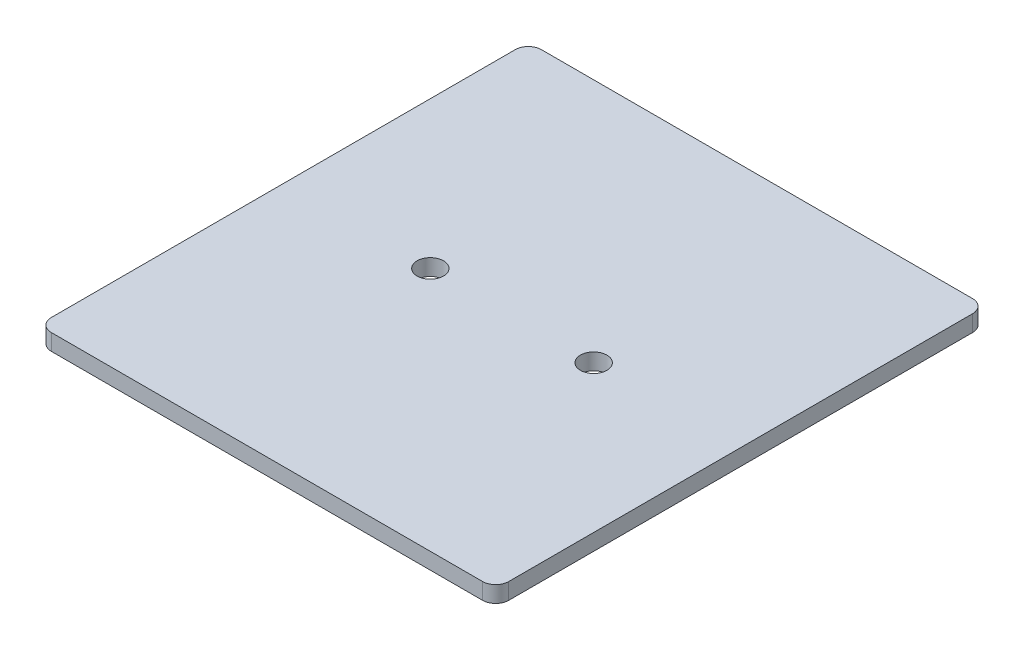
ISO-10303-21;
HEADER;
FILE_DESCRIPTION(('STEP AP214'),'2;1');
FILE_NAME('part.step','',(''),(''),'','','');
FILE_SCHEMA(('AUTOMOTIVE_DESIGN { 1 0 10303 214 1 1 1 1 }'));
ENDSEC;
DATA;
#1=APPLICATION_CONTEXT('core data for automotive mechanical design processes');
#2=APPLICATION_PROTOCOL_DEFINITION('international standard','automotive_design',2000,#1);
#3=PRODUCT_CONTEXT('',#1,'mechanical');
#4=PRODUCT('Part','Part','',(#3));
#5=PRODUCT_RELATED_PRODUCT_CATEGORY('part','',(#4));
#6=PRODUCT_DEFINITION_FORMATION('','',#4);
#7=PRODUCT_DEFINITION_CONTEXT('part definition',#1,'design');
#8=PRODUCT_DEFINITION('design','',#6,#7);
#9=PRODUCT_DEFINITION_SHAPE('','',#8);
#10=(LENGTH_UNIT() NAMED_UNIT(*) SI_UNIT(.MILLI.,.METRE.));
#11=(NAMED_UNIT(*) PLANE_ANGLE_UNIT() SI_UNIT($,.RADIAN.));
#12=(NAMED_UNIT(*) SI_UNIT($,.STERADIAN.) SOLID_ANGLE_UNIT());
#13=UNCERTAINTY_MEASURE_WITH_UNIT(LENGTH_MEASURE(1.E-05),#10,'distance_accuracy_value','');
#14=(GEOMETRIC_REPRESENTATION_CONTEXT(3) GLOBAL_UNCERTAINTY_ASSIGNED_CONTEXT((#13)) GLOBAL_UNIT_ASSIGNED_CONTEXT((#10,
#11,#12)) REPRESENTATION_CONTEXT('',''));
#15=CARTESIAN_POINT('',(0.,0.,0.));
#16=DIRECTION('',(0.,0.,1.));
#17=DIRECTION('',(1.,0.,0.));
#18=AXIS2_PLACEMENT_3D('',#15,#16,#17);
#19=CARTESIAN_POINT('',(70.,5.,-75.));
#20=DIRECTION('',(-1.,0.,0.));
#21=DIRECTION('',(0.,0.,1.));
#22=AXIS2_PLACEMENT_3D('',#19,#20,#21);
#23=PLANE('',#22);
#24=DIRECTION('',(0.,0.,-1.));
#25=VECTOR('',#24,1.);
#26=CARTESIAN_POINT('',(70.,0.,-75.));
#27=LINE('',#26,#25);
#28=CARTESIAN_POINT('',(70.,0.,71.));
#29=VERTEX_POINT('',#28);
#30=CARTESIAN_POINT('',(70.,0.,-71.));
#31=VERTEX_POINT('',#30);
#32=EDGE_CURVE('E138',#29,#31,#27,.T.);
#33=ORIENTED_EDGE('',*,*,#32,.T.);
#34=DIRECTION('',(0.,-1.,0.));
#35=VECTOR('',#34,1.);
#36=CARTESIAN_POINT('',(70.,5.,-71.));
#37=LINE('',#36,#35);
#38=CARTESIAN_POINT('',(70.,5.,-71.));
#39=VERTEX_POINT('',#38);
#40=EDGE_CURVE('E112',#31,#39,#37,.F.);
#41=ORIENTED_EDGE('',*,*,#40,.T.);
#42=DIRECTION('',(0.,0.,-1.));
#43=VECTOR('',#42,1.);
#44=CARTESIAN_POINT('',(70.,5.,-75.));
#45=LINE('',#44,#43);
#46=CARTESIAN_POINT('',(70.,5.,71.));
#47=VERTEX_POINT('',#46);
#48=EDGE_CURVE('E151',#47,#39,#45,.T.);
#49=ORIENTED_EDGE('',*,*,#48,.F.);
#50=DIRECTION('',(0.,-1.,0.));
#51=VECTOR('',#50,1.);
#52=CARTESIAN_POINT('',(70.,5.,71.));
#53=LINE('',#52,#51);
#54=EDGE_CURVE('E118',#47,#29,#53,.T.);
#55=ORIENTED_EDGE('',*,*,#54,.T.);
#56=EDGE_LOOP('',(#33,#41,#49,#55));
#57=FACE_BOUND('',#56,.T.);
#58=ADVANCED_FACE('F39',(#57),#23,.F.);
#59=CARTESIAN_POINT('',(-70.,5.,-75.));
#60=DIRECTION('',(0.,0.,1.));
#61=DIRECTION('',(1.,0.,0.));
#62=AXIS2_PLACEMENT_3D('',#59,#60,#61);
#63=PLANE('',#62);
#64=DIRECTION('',(-1.,0.,0.));
#65=VECTOR('',#64,1.);
#66=CARTESIAN_POINT('',(-70.,5.,-75.));
#67=LINE('',#66,#65);
#68=CARTESIAN_POINT('',(66.,5.,-75.));
#69=VERTEX_POINT('',#68);
#70=CARTESIAN_POINT('',(-66.,5.,-75.));
#71=VERTEX_POINT('',#70);
#72=EDGE_CURVE('E128',#69,#71,#67,.T.);
#73=ORIENTED_EDGE('',*,*,#72,.F.);
#74=DIRECTION('',(0.,-1.,0.));
#75=VECTOR('',#74,1.);
#76=CARTESIAN_POINT('',(66.,5.,-75.));
#77=LINE('',#76,#75);
#78=CARTESIAN_POINT('',(66.,0.,-75.));
#79=VERTEX_POINT('',#78);
#80=EDGE_CURVE('E111',#69,#79,#77,.T.);
#81=ORIENTED_EDGE('',*,*,#80,.T.);
#82=DIRECTION('',(-1.,0.,0.));
#83=VECTOR('',#82,1.);
#84=CARTESIAN_POINT('',(-70.,0.,-75.));
#85=LINE('',#84,#83);
#86=CARTESIAN_POINT('',(-66.,0.,-75.));
#87=VERTEX_POINT('',#86);
#88=EDGE_CURVE('E125',#79,#87,#85,.T.);
#89=ORIENTED_EDGE('',*,*,#88,.T.);
#90=DIRECTION('',(0.,-1.,0.));
#91=VECTOR('',#90,1.);
#92=CARTESIAN_POINT('',(-66.,5.,-75.));
#93=LINE('',#92,#91);
#94=EDGE_CURVE('E131',#87,#71,#93,.F.);
#95=ORIENTED_EDGE('',*,*,#94,.T.);
#96=EDGE_LOOP('',(#73,#81,#89,#95));
#97=FACE_BOUND('',#96,.T.);
#98=ADVANCED_FACE('F124',(#97),#63,.F.);
#99=CARTESIAN_POINT('',(-70.,5.,-75.));
#100=DIRECTION('',(1.,0.,0.));
#101=DIRECTION('',(0.,0.,-1.));
#102=AXIS2_PLACEMENT_3D('',#99,#100,#101);
#103=PLANE('',#102);
#104=DIRECTION('',(0.,0.,1.));
#105=VECTOR('',#104,1.);
#106=CARTESIAN_POINT('',(-70.,5.,-75.));
#107=LINE('',#106,#105);
#108=CARTESIAN_POINT('',(-70.,5.,-71.));
#109=VERTEX_POINT('',#108);
#110=CARTESIAN_POINT('',(-70.,5.,71.));
#111=VERTEX_POINT('',#110);
#112=EDGE_CURVE('E187',#109,#111,#107,.T.);
#113=ORIENTED_EDGE('',*,*,#112,.F.);
#114=DIRECTION('',(0.,-1.,0.));
#115=VECTOR('',#114,1.);
#116=CARTESIAN_POINT('',(-70.,5.,-71.));
#117=LINE('',#116,#115);
#118=CARTESIAN_POINT('',(-70.,0.,-71.));
#119=VERTEX_POINT('',#118);
#120=EDGE_CURVE('E11',#109,#119,#117,.T.);
#121=ORIENTED_EDGE('',*,*,#120,.T.);
#122=DIRECTION('',(0.,0.,1.));
#123=VECTOR('',#122,1.);
#124=CARTESIAN_POINT('',(-70.,0.,-75.));
#125=LINE('',#124,#123);
#126=CARTESIAN_POINT('',(-70.,0.,71.));
#127=VERTEX_POINT('',#126);
#128=EDGE_CURVE('E137',#119,#127,#125,.T.);
#129=ORIENTED_EDGE('',*,*,#128,.T.);
#130=DIRECTION('',(0.,-1.,0.));
#131=VECTOR('',#130,1.);
#132=CARTESIAN_POINT('',(-70.,5.,71.));
#133=LINE('',#132,#131);
#134=EDGE_CURVE('E48',#127,#111,#133,.F.);
#135=ORIENTED_EDGE('',*,*,#134,.T.);
#136=EDGE_LOOP('',(#113,#121,#129,#135));
#137=FACE_BOUND('',#136,.T.);
#138=ADVANCED_FACE('F186',(#137),#103,.F.);
#139=CARTESIAN_POINT('',(-70.,5.,75.));
#140=DIRECTION('',(0.,0.,-1.));
#141=DIRECTION('',(-1.,0.,0.));
#142=AXIS2_PLACEMENT_3D('',#139,#140,#141);
#143=PLANE('',#142);
#144=DIRECTION('',(1.,0.,0.));
#145=VECTOR('',#144,1.);
#146=CARTESIAN_POINT('',(-70.,0.,75.));
#147=LINE('',#146,#145);
#148=CARTESIAN_POINT('',(-66.,0.,75.));
#149=VERTEX_POINT('',#148);
#150=CARTESIAN_POINT('',(66.,0.,75.));
#151=VERTEX_POINT('',#150);
#152=EDGE_CURVE('E143',#149,#151,#147,.T.);
#153=ORIENTED_EDGE('',*,*,#152,.T.);
#154=DIRECTION('',(0.,-1.,0.));
#155=VECTOR('',#154,1.);
#156=CARTESIAN_POINT('',(66.,5.,75.));
#157=LINE('',#156,#155);
#158=CARTESIAN_POINT('',(66.,5.,75.));
#159=VERTEX_POINT('',#158);
#160=EDGE_CURVE('E55',#151,#159,#157,.F.);
#161=ORIENTED_EDGE('',*,*,#160,.T.);
#162=DIRECTION('',(1.,0.,0.));
#163=VECTOR('',#162,1.);
#164=CARTESIAN_POINT('',(-70.,5.,75.));
#165=LINE('',#164,#163);
#166=CARTESIAN_POINT('',(-66.,5.,75.));
#167=VERTEX_POINT('',#166);
#168=EDGE_CURVE('E153',#167,#159,#165,.T.);
#169=ORIENTED_EDGE('',*,*,#168,.F.);
#170=DIRECTION('',(0.,-1.,0.));
#171=VECTOR('',#170,1.);
#172=CARTESIAN_POINT('',(-66.,5.,75.));
#173=LINE('',#172,#171);
#174=EDGE_CURVE('E177',#167,#149,#173,.T.);
#175=ORIENTED_EDGE('',*,*,#174,.T.);
#176=EDGE_LOOP('',(#153,#161,#169,#175));
#177=FACE_BOUND('',#176,.T.);
#178=ADVANCED_FACE('F197',(#177),#143,.F.);
#179=CARTESIAN_POINT('',(0.,5.,0.));
#180=DIRECTION('',(0.,1.,0.));
#181=DIRECTION('',(0.,0.,1.));
#182=AXIS2_PLACEMENT_3D('',#179,#180,#181);
#183=PLANE('',#182);
#184=CARTESIAN_POINT('',(25.,5.,0.));
#185=DIRECTION('',(0.,-1.,0.));
#186=DIRECTION('',(0.,0.,1.));
#187=AXIS2_PLACEMENT_3D('',#184,#185,#186);
#188=CIRCLE('',#187,4.05);
#189=CARTESIAN_POINT('',(25.,5.,4.05));
#190=VERTEX_POINT('',#189);
#191=EDGE_CURVE('E218',#190,#190,#188,.T.);
#192=ORIENTED_EDGE('',*,*,#191,.T.);
#193=EDGE_LOOP('',(#192));
#194=FACE_BOUND('',#193,.T.);
#195=CARTESIAN_POINT('',(-25.,5.,0.));
#196=DIRECTION('',(0.,1.,0.));
#197=DIRECTION('',(0.,0.,1.));
#198=AXIS2_PLACEMENT_3D('',#195,#196,#197);
#199=CIRCLE('',#198,4.05);
#200=CARTESIAN_POINT('',(-25.,5.,4.05));
#201=VERTEX_POINT('',#200);
#202=EDGE_CURVE('E209',#201,#201,#199,.T.);
#203=ORIENTED_EDGE('',*,*,#202,.F.);
#204=EDGE_LOOP('',(#203));
#205=FACE_BOUND('',#204,.T.);
#206=ORIENTED_EDGE('',*,*,#48,.T.);
#207=CARTESIAN_POINT('',(66.,5.,-71.));
#208=DIRECTION('',(0.,1.,0.));
#209=DIRECTION('',(0.,0.,1.));
#210=AXIS2_PLACEMENT_3D('',#207,#208,#209);
#211=CIRCLE('',#210,4.);
#212=EDGE_CURVE('E174',#39,#69,#211,.T.);
#213=ORIENTED_EDGE('',*,*,#212,.T.);
#214=ORIENTED_EDGE('',*,*,#72,.T.);
#215=CARTESIAN_POINT('',(-66.,5.,-71.));
#216=DIRECTION('',(0.,1.,0.));
#217=DIRECTION('',(0.,0.,1.));
#218=AXIS2_PLACEMENT_3D('',#215,#216,#217);
#219=CIRCLE('',#218,4.);
#220=EDGE_CURVE('E168',#71,#109,#219,.T.);
#221=ORIENTED_EDGE('',*,*,#220,.T.);
#222=ORIENTED_EDGE('',*,*,#112,.T.);
#223=CARTESIAN_POINT('',(-66.,5.,71.));
#224=DIRECTION('',(0.,1.,0.));
#225=DIRECTION('',(0.,0.,1.));
#226=AXIS2_PLACEMENT_3D('',#223,#224,#225);
#227=CIRCLE('',#226,4.);
#228=EDGE_CURVE('E62',#111,#167,#227,.T.);
#229=ORIENTED_EDGE('',*,*,#228,.T.);
#230=ORIENTED_EDGE('',*,*,#168,.T.);
#231=CARTESIAN_POINT('',(66.,5.,71.));
#232=DIRECTION('',(0.,1.,0.));
#233=DIRECTION('',(0.,0.,1.));
#234=AXIS2_PLACEMENT_3D('',#231,#232,#233);
#235=CIRCLE('',#234,4.);
#236=EDGE_CURVE('E171',#159,#47,#235,.T.);
#237=ORIENTED_EDGE('',*,*,#236,.T.);
#238=EDGE_LOOP('',(#206,#213,#214,#221,#222,#229,#230,#237));
#239=FACE_BOUND('',#238,.T.);
#240=ADVANCED_FACE('F191',(#194,#205,#239),#183,.T.);
#241=CARTESIAN_POINT('',(0.,0.,0.));
#242=DIRECTION('',(0.,1.,0.));
#243=DIRECTION('',(0.,0.,1.));
#244=AXIS2_PLACEMENT_3D('',#241,#242,#243);
#245=PLANE('',#244);
#246=CARTESIAN_POINT('',(25.,0.,0.));
#247=DIRECTION('',(0.,-1.,0.));
#248=DIRECTION('',(0.,0.,1.));
#249=AXIS2_PLACEMENT_3D('',#246,#247,#248);
#250=CIRCLE('',#249,4.05);
#251=CARTESIAN_POINT('',(25.,0.,4.05));
#252=VERTEX_POINT('',#251);
#253=EDGE_CURVE('E214',#252,#252,#250,.T.);
#254=ORIENTED_EDGE('',*,*,#253,.F.);
#255=EDGE_LOOP('',(#254));
#256=FACE_BOUND('',#255,.T.);
#257=CARTESIAN_POINT('',(-25.,0.,0.));
#258=DIRECTION('',(0.,1.,0.));
#259=DIRECTION('',(0.,0.,1.));
#260=AXIS2_PLACEMENT_3D('',#257,#258,#259);
#261=CIRCLE('',#260,4.05);
#262=CARTESIAN_POINT('',(-25.,0.,4.05));
#263=VERTEX_POINT('',#262);
#264=EDGE_CURVE('E145',#263,#263,#261,.T.);
#265=ORIENTED_EDGE('',*,*,#264,.T.);
#266=EDGE_LOOP('',(#265));
#267=FACE_BOUND('',#266,.T.);
#268=ORIENTED_EDGE('',*,*,#88,.F.);
#269=CARTESIAN_POINT('',(66.,0.,-71.));
#270=DIRECTION('',(0.,1.,0.));
#271=DIRECTION('',(0.,0.,1.));
#272=AXIS2_PLACEMENT_3D('',#269,#270,#271);
#273=CIRCLE('',#272,4.);
#274=EDGE_CURVE('E107',#79,#31,#273,.F.);
#275=ORIENTED_EDGE('',*,*,#274,.T.);
#276=ORIENTED_EDGE('',*,*,#32,.F.);
#277=CARTESIAN_POINT('',(66.,0.,71.));
#278=DIRECTION('',(0.,1.,0.));
#279=DIRECTION('',(0.,0.,1.));
#280=AXIS2_PLACEMENT_3D('',#277,#278,#279);
#281=CIRCLE('',#280,4.);
#282=EDGE_CURVE('E119',#29,#151,#281,.F.);
#283=ORIENTED_EDGE('',*,*,#282,.T.);
#284=ORIENTED_EDGE('',*,*,#152,.F.);
#285=CARTESIAN_POINT('',(-66.,0.,71.));
#286=DIRECTION('',(0.,1.,0.));
#287=DIRECTION('',(0.,0.,1.));
#288=AXIS2_PLACEMENT_3D('',#285,#286,#287);
#289=CIRCLE('',#288,4.);
#290=EDGE_CURVE('E130',#149,#127,#289,.F.);
#291=ORIENTED_EDGE('',*,*,#290,.T.);
#292=ORIENTED_EDGE('',*,*,#128,.F.);
#293=CARTESIAN_POINT('',(-66.,0.,-71.));
#294=DIRECTION('',(0.,1.,0.));
#295=DIRECTION('',(0.,0.,1.));
#296=AXIS2_PLACEMENT_3D('',#293,#294,#295);
#297=CIRCLE('',#296,4.);
#298=EDGE_CURVE('E135',#119,#87,#297,.F.);
#299=ORIENTED_EDGE('',*,*,#298,.T.);
#300=EDGE_LOOP('',(#268,#275,#276,#283,#284,#291,#292,#299));
#301=FACE_BOUND('',#300,.T.);
#302=ADVANCED_FACE('F133',(#256,#267,#301),#245,.F.);
#303=CARTESIAN_POINT('',(-25.,0.,0.));
#304=DIRECTION('',(0.,1.,0.));
#305=DIRECTION('',(0.,0.,1.));
#306=AXIS2_PLACEMENT_3D('',#303,#304,#305);
#307=CYLINDRICAL_SURFACE('',#306,4.05);
#308=ORIENTED_EDGE('',*,*,#264,.F.);
#309=EDGE_LOOP('',(#308));
#310=FACE_BOUND('',#309,.T.);
#311=ORIENTED_EDGE('',*,*,#202,.T.);
#312=EDGE_LOOP('',(#311));
#313=FACE_BOUND('',#312,.T.);
#314=ADVANCED_FACE('F231',(#310,#313),#307,.F.);
#315=CARTESIAN_POINT('',(25.,0.,0.));
#316=DIRECTION('',(0.,1.,0.));
#317=DIRECTION('',(0.,0.,1.));
#318=AXIS2_PLACEMENT_3D('',#315,#316,#317);
#319=CYLINDRICAL_SURFACE('',#318,4.05);
#320=ORIENTED_EDGE('',*,*,#253,.T.);
#321=EDGE_LOOP('',(#320));
#322=FACE_BOUND('',#321,.T.);
#323=ORIENTED_EDGE('',*,*,#191,.F.);
#324=EDGE_LOOP('',(#323));
#325=FACE_BOUND('',#324,.T.);
#326=ADVANCED_FACE('F226',(#322,#325),#319,.F.);
#327=CARTESIAN_POINT('',(66.,5.,-71.));
#328=DIRECTION('',(0.,-1.,0.));
#329=DIRECTION('',(0.,0.,-1.));
#330=AXIS2_PLACEMENT_3D('',#327,#328,#329);
#331=CYLINDRICAL_SURFACE('',#330,4.);
#332=ORIENTED_EDGE('',*,*,#212,.F.);
#333=ORIENTED_EDGE('',*,*,#40,.F.);
#334=ORIENTED_EDGE('',*,*,#274,.F.);
#335=ORIENTED_EDGE('',*,*,#80,.F.);
#336=EDGE_LOOP('',(#332,#333,#334,#335));
#337=FACE_BOUND('',#336,.T.);
#338=ADVANCED_FACE('F110',(#337),#331,.T.);
#339=CARTESIAN_POINT('',(66.,5.,71.));
#340=DIRECTION('',(0.,-1.,0.));
#341=DIRECTION('',(0.,0.,-1.));
#342=AXIS2_PLACEMENT_3D('',#339,#340,#341);
#343=CYLINDRICAL_SURFACE('',#342,4.);
#344=ORIENTED_EDGE('',*,*,#236,.F.);
#345=ORIENTED_EDGE('',*,*,#160,.F.);
#346=ORIENTED_EDGE('',*,*,#282,.F.);
#347=ORIENTED_EDGE('',*,*,#54,.F.);
#348=EDGE_LOOP('',(#344,#345,#346,#347));
#349=FACE_BOUND('',#348,.T.);
#350=ADVANCED_FACE('F201',(#349),#343,.T.);
#351=CARTESIAN_POINT('',(-66.,5.,-71.));
#352=DIRECTION('',(0.,-1.,0.));
#353=DIRECTION('',(0.,0.,-1.));
#354=AXIS2_PLACEMENT_3D('',#351,#352,#353);
#355=CYLINDRICAL_SURFACE('',#354,4.);
#356=ORIENTED_EDGE('',*,*,#220,.F.);
#357=ORIENTED_EDGE('',*,*,#94,.F.);
#358=ORIENTED_EDGE('',*,*,#298,.F.);
#359=ORIENTED_EDGE('',*,*,#120,.F.);
#360=EDGE_LOOP('',(#356,#357,#358,#359));
#361=FACE_BOUND('',#360,.T.);
#362=ADVANCED_FACE('F258',(#361),#355,.T.);
#363=CARTESIAN_POINT('',(-66.,5.,71.));
#364=DIRECTION('',(0.,-1.,0.));
#365=DIRECTION('',(0.,0.,-1.));
#366=AXIS2_PLACEMENT_3D('',#363,#364,#365);
#367=CYLINDRICAL_SURFACE('',#366,4.);
#368=ORIENTED_EDGE('',*,*,#228,.F.);
#369=ORIENTED_EDGE('',*,*,#134,.F.);
#370=ORIENTED_EDGE('',*,*,#290,.F.);
#371=ORIENTED_EDGE('',*,*,#174,.F.);
#372=EDGE_LOOP('',(#368,#369,#370,#371));
#373=FACE_BOUND('',#372,.T.);
#374=ADVANCED_FACE('F41',(#373),#367,.T.);
#375=CLOSED_SHELL('',(#58,#98,#138,#178,#240,#302,#314,#326,#338,#350,#362,#374));
#376=MANIFOLD_SOLID_BREP('B2',#375);
#377=ADVANCED_BREP_SHAPE_REPRESENTATION('',(#18,#376),#14);
#378=SHAPE_DEFINITION_REPRESENTATION(#9,#377);
ENDSEC;
END-ISO-10303-21;
